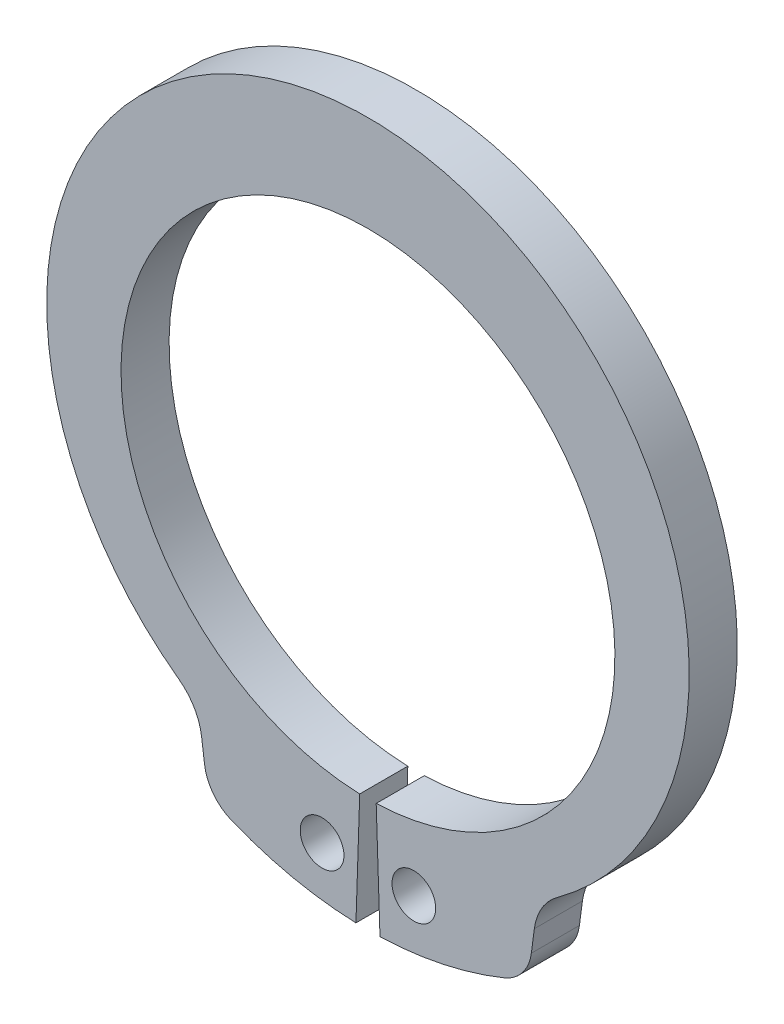
ISO-10303-21;
HEADER;
FILE_DESCRIPTION(('STEP AP214'),'2;1');
FILE_NAME('part.step','',(''),(''),'','','');
FILE_SCHEMA(('AUTOMOTIVE_DESIGN { 1 0 10303 214 1 1 1 1 }'));
ENDSEC;
DATA;
#1=APPLICATION_CONTEXT('core data for automotive mechanical design processes');
#2=APPLICATION_PROTOCOL_DEFINITION('international standard','automotive_design',2000,#1);
#3=PRODUCT_CONTEXT('',#1,'mechanical');
#4=PRODUCT('Part','Part','',(#3));
#5=PRODUCT_RELATED_PRODUCT_CATEGORY('part','',(#4));
#6=PRODUCT_DEFINITION_FORMATION('','',#4);
#7=PRODUCT_DEFINITION_CONTEXT('part definition',#1,'design');
#8=PRODUCT_DEFINITION('design','',#6,#7);
#9=PRODUCT_DEFINITION_SHAPE('','',#8);
#10=(LENGTH_UNIT() NAMED_UNIT(*) SI_UNIT(.MILLI.,.METRE.));
#11=(NAMED_UNIT(*) PLANE_ANGLE_UNIT() SI_UNIT($,.RADIAN.));
#12=(NAMED_UNIT(*) SI_UNIT($,.STERADIAN.) SOLID_ANGLE_UNIT());
#13=UNCERTAINTY_MEASURE_WITH_UNIT(LENGTH_MEASURE(1.E-05),#10,'distance_accuracy_value','');
#14=(GEOMETRIC_REPRESENTATION_CONTEXT(3) GLOBAL_UNCERTAINTY_ASSIGNED_CONTEXT((#13)) GLOBAL_UNIT_ASSIGNED_CONTEXT((#10,
#11,#12)) REPRESENTATION_CONTEXT('',''));
#15=CARTESIAN_POINT('',(0.,0.,0.));
#16=DIRECTION('',(0.,0.,1.));
#17=DIRECTION('',(1.,0.,0.));
#18=AXIS2_PLACEMENT_3D('',#15,#16,#17);
#19=CARTESIAN_POINT('',(0.,0.,-1.1));
#20=DIRECTION('',(0.,0.,1.));
#21=DIRECTION('',(1.,0.,0.));
#22=AXIS2_PLACEMENT_3D('',#19,#20,#21);
#23=CYLINDRICAL_SURFACE('',#22,5.65);
#24=CARTESIAN_POINT('',(0.,0.,0.));
#25=DIRECTION('',(0.,0.,-1.));
#26=DIRECTION('',(1.,0.,0.));
#27=AXIS2_PLACEMENT_3D('',#24,#25,#26);
#28=CIRCLE('',#27,5.65);
#29=CARTESIAN_POINT('',(-0.188333333333332,-5.64686023871279,0.));
#30=VERTEX_POINT('',#29);
#31=CARTESIAN_POINT('',(0.188333333333332,-5.6468602387128,0.));
#32=VERTEX_POINT('',#31);
#33=EDGE_CURVE('E166',#30,#32,#28,.T.);
#34=ORIENTED_EDGE('',*,*,#33,.F.);
#35=DIRECTION('',(0.,0.,1.));
#36=VECTOR('',#35,1.);
#37=CARTESIAN_POINT('',(-0.188333333333332,-5.64686023871279,-1.1));
#38=LINE('',#37,#36);
#39=CARTESIAN_POINT('',(-0.188333333333332,-5.64686023871279,-1.1));
#40=VERTEX_POINT('',#39);
#41=EDGE_CURVE('E11',#40,#30,#38,.T.);
#42=ORIENTED_EDGE('',*,*,#41,.F.);
#43=CARTESIAN_POINT('',(0.,0.,-1.1));
#44=DIRECTION('',(0.,0.,-1.));
#45=DIRECTION('',(1.,0.,0.));
#46=AXIS2_PLACEMENT_3D('',#43,#44,#45);
#47=CIRCLE('',#46,5.65);
#48=CARTESIAN_POINT('',(0.188333333333332,-5.6468602387128,-1.1));
#49=VERTEX_POINT('',#48);
#50=EDGE_CURVE('E211',#40,#49,#47,.T.);
#51=ORIENTED_EDGE('',*,*,#50,.T.);
#52=DIRECTION('',(0.,0.,1.));
#53=VECTOR('',#52,1.);
#54=CARTESIAN_POINT('',(0.188333333333332,-5.6468602387128,-1.1));
#55=LINE('',#54,#53);
#56=EDGE_CURVE('E41',#49,#32,#55,.T.);
#57=ORIENTED_EDGE('',*,*,#56,.T.);
#58=EDGE_LOOP('',(#34,#42,#51,#57));
#59=FACE_BOUND('',#58,.T.);
#60=ADVANCED_FACE('F38',(#59),#23,.F.);
#61=CARTESIAN_POINT('',(-0.188333333333332,-5.64686023871279,-1.1));
#62=DIRECTION('',(0.999444290037663,-0.0333333333333333,0.));
#63=DIRECTION('',(0.0333333333333333,0.999444290037663,0.));
#64=AXIS2_PLACEMENT_3D('',#61,#62,#63);
#65=PLANE('',#64);
#66=DIRECTION('',(0.0333333333333333,0.999444290037663,0.));
#67=VECTOR('',#66,1.);
#68=CARTESIAN_POINT('',(-0.188333333333332,-5.64686023871279,0.));
#69=LINE('',#68,#67);
#70=CARTESIAN_POINT('',(-0.275000000000001,-8.24541539281072,0.));
#71=VERTEX_POINT('',#70);
#72=EDGE_CURVE('E208',#71,#30,#69,.T.);
#73=ORIENTED_EDGE('',*,*,#72,.F.);
#74=DIRECTION('',(0.,0.,1.));
#75=VECTOR('',#74,1.);
#76=CARTESIAN_POINT('',(-0.275000000000001,-8.24541539281072,-1.1));
#77=LINE('',#76,#75);
#78=CARTESIAN_POINT('',(-0.275000000000001,-8.24541539281072,-1.1));
#79=VERTEX_POINT('',#78);
#80=EDGE_CURVE('E48',#79,#71,#77,.T.);
#81=ORIENTED_EDGE('',*,*,#80,.F.);
#82=DIRECTION('',(0.0333333333333333,0.999444290037663,0.));
#83=VECTOR('',#82,1.);
#84=CARTESIAN_POINT('',(-0.188333333333332,-5.64686023871279,-1.1));
#85=LINE('',#84,#83);
#86=EDGE_CURVE('E151',#79,#40,#85,.T.);
#87=ORIENTED_EDGE('',*,*,#86,.T.);
#88=ORIENTED_EDGE('',*,*,#41,.T.);
#89=EDGE_LOOP('',(#73,#81,#87,#88));
#90=FACE_BOUND('',#89,.T.);
#91=ADVANCED_FACE('F243',(#90),#65,.T.);
#92=CARTESIAN_POINT('',(0.,0.,-1.1));
#93=DIRECTION('',(0.,0.,1.));
#94=DIRECTION('',(1.,0.,0.));
#95=AXIS2_PLACEMENT_3D('',#92,#93,#94);
#96=CYLINDRICAL_SURFACE('',#95,8.25);
#97=CARTESIAN_POINT('',(0.,0.,0.));
#98=DIRECTION('',(0.,0.,1.));
#99=DIRECTION('',(1.,0.,0.));
#100=AXIS2_PLACEMENT_3D('',#97,#98,#99);
#101=CIRCLE('',#100,8.25);
#102=CARTESIAN_POINT('',(-3.12546960972697,-7.63504680527062,0.));
#103=VERTEX_POINT('',#102);
#104=EDGE_CURVE('E137',#103,#71,#101,.T.);
#105=ORIENTED_EDGE('',*,*,#104,.F.);
#106=DIRECTION('',(0.,0.,1.));
#107=VECTOR('',#106,1.);
#108=CARTESIAN_POINT('',(-3.12546960972697,-7.63504680527062,-1.1));
#109=LINE('',#108,#107);
#110=CARTESIAN_POINT('',(-3.12546960972697,-7.63504680527062,-1.1));
#111=VERTEX_POINT('',#110);
#112=EDGE_CURVE('E132',#111,#103,#109,.T.);
#113=ORIENTED_EDGE('',*,*,#112,.F.);
#114=CARTESIAN_POINT('',(0.,0.,-1.1));
#115=DIRECTION('',(0.,0.,1.));
#116=DIRECTION('',(1.,0.,0.));
#117=AXIS2_PLACEMENT_3D('',#114,#115,#116);
#118=CIRCLE('',#117,8.25);
#119=EDGE_CURVE('E135',#111,#79,#118,.T.);
#120=ORIENTED_EDGE('',*,*,#119,.T.);
#121=ORIENTED_EDGE('',*,*,#80,.T.);
#122=EDGE_LOOP('',(#105,#113,#120,#121));
#123=FACE_BOUND('',#122,.T.);
#124=ADVANCED_FACE('F134',(#123),#96,.T.);
#125=CARTESIAN_POINT('',(-2.74662480854794,-6.70958658644994,-1.1));
#126=DIRECTION('',(0.,0.,1.));
#127=DIRECTION('',(1.,0.,0.));
#128=AXIS2_PLACEMENT_3D('',#125,#126,#127);
#129=CYLINDRICAL_SURFACE('',#128,1.);
#130=CARTESIAN_POINT('',(-2.74662480854794,-6.70958658644994,0.));
#131=DIRECTION('',(0.,0.,1.));
#132=DIRECTION('',(1.,0.,0.));
#133=AXIS2_PLACEMENT_3D('',#130,#131,#132);
#134=CIRCLE('',#133,1.);
#135=CARTESIAN_POINT('',(-3.73806966992175,-6.84011277867,0.));
#136=VERTEX_POINT('',#135);
#137=EDGE_CURVE('E203',#136,#103,#134,.T.);
#138=ORIENTED_EDGE('',*,*,#137,.F.);
#139=DIRECTION('',(0.,0.,1.));
#140=VECTOR('',#139,1.);
#141=CARTESIAN_POINT('',(-3.73806966992175,-6.84011277867,-1.1));
#142=LINE('',#141,#140);
#143=CARTESIAN_POINT('',(-3.73806966992175,-6.84011277867,-1.1));
#144=VERTEX_POINT('',#143);
#145=EDGE_CURVE('E143',#144,#136,#142,.T.);
#146=ORIENTED_EDGE('',*,*,#145,.F.);
#147=CARTESIAN_POINT('',(-2.74662480854794,-6.70958658644994,-1.1));
#148=DIRECTION('',(0.,0.,1.));
#149=DIRECTION('',(1.,0.,0.));
#150=AXIS2_PLACEMENT_3D('',#147,#148,#149);
#151=CIRCLE('',#150,1.);
#152=EDGE_CURVE('E149',#144,#111,#151,.T.);
#153=ORIENTED_EDGE('',*,*,#152,.T.);
#154=ORIENTED_EDGE('',*,*,#112,.T.);
#155=EDGE_LOOP('',(#138,#146,#153,#154));
#156=FACE_BOUND('',#155,.T.);
#157=ADVANCED_FACE('F154',(#156),#129,.T.);
#158=CARTESIAN_POINT('',(-3.80660395669724,-6.31954318803232,-1.1));
#159=DIRECTION('',(-0.991444861373811,-0.130526192220045,0.));
#160=DIRECTION('',(0.130526192220045,-0.991444861373811,0.));
#161=AXIS2_PLACEMENT_3D('',#158,#159,#160);
#162=PLANE('',#161);
#163=DIRECTION('',(0.130526192220045,-0.991444861373811,0.));
#164=VECTOR('',#163,1.);
#165=CARTESIAN_POINT('',(-3.80660395669724,-6.31954318803232,0.));
#166=LINE('',#165,#164);
#167=CARTESIAN_POINT('',(-3.80660395669724,-6.31954318803232,0.));
#168=VERTEX_POINT('',#167);
#169=EDGE_CURVE('E199',#168,#136,#166,.T.);
#170=ORIENTED_EDGE('',*,*,#169,.F.);
#171=DIRECTION('',(0.,0.,1.));
#172=VECTOR('',#171,1.);
#173=CARTESIAN_POINT('',(-3.80660395669724,-6.31954318803232,-1.1));
#174=LINE('',#173,#172);
#175=CARTESIAN_POINT('',(-3.80660395669724,-6.31954318803232,-1.1));
#176=VERTEX_POINT('',#175);
#177=EDGE_CURVE('E217',#176,#168,#174,.T.);
#178=ORIENTED_EDGE('',*,*,#177,.F.);
#179=DIRECTION('',(0.130526192220045,-0.991444861373811,0.));
#180=VECTOR('',#179,1.);
#181=CARTESIAN_POINT('',(-3.80660395669724,-6.31954318803232,-1.1));
#182=LINE('',#181,#180);
#183=EDGE_CURVE('E156',#176,#144,#182,.T.);
#184=ORIENTED_EDGE('',*,*,#183,.T.);
#185=ORIENTED_EDGE('',*,*,#145,.T.);
#186=EDGE_LOOP('',(#170,#178,#184,#185));
#187=FACE_BOUND('',#186,.T.);
#188=ADVANCED_FACE('F256',(#187),#162,.T.);
#189=CARTESIAN_POINT('',(-5.09451495681991,-6.48909988786875,-1.1));
#190=DIRECTION('',(0.,0.,1.));
#191=DIRECTION('',(1.,0.,0.));
#192=AXIS2_PLACEMENT_3D('',#189,#190,#191);
#193=CYLINDRICAL_SURFACE('',#192,1.29902433337347);
#194=CARTESIAN_POINT('',(-5.09451495681991,-6.48909988786875,0.));
#195=DIRECTION('',(0.,0.,-1.));
#196=DIRECTION('',(1.,0.,0.));
#197=AXIS2_PLACEMENT_3D('',#194,#195,#196);
#198=CIRCLE('',#197,1.29902433337347);
#199=CARTESIAN_POINT('',(-4.32934225762726,-5.43934993711542,0.));
#200=VERTEX_POINT('',#199);
#201=EDGE_CURVE('E195',#200,#168,#198,.T.);
#202=ORIENTED_EDGE('',*,*,#201,.F.);
#203=DIRECTION('',(0.,0.,1.));
#204=VECTOR('',#203,1.);
#205=CARTESIAN_POINT('',(-4.32934225762726,-5.43934993711542,-1.1));
#206=LINE('',#205,#204);
#207=CARTESIAN_POINT('',(-4.32934225762726,-5.43934993711542,-1.1));
#208=VERTEX_POINT('',#207);
#209=EDGE_CURVE('E220',#208,#200,#206,.T.);
#210=ORIENTED_EDGE('',*,*,#209,.F.);
#211=CARTESIAN_POINT('',(-5.09451495681991,-6.48909988786875,-1.1));
#212=DIRECTION('',(0.,0.,-1.));
#213=DIRECTION('',(1.,0.,0.));
#214=AXIS2_PLACEMENT_3D('',#211,#212,#213);
#215=CIRCLE('',#214,1.29902433337347);
#216=EDGE_CURVE('E160',#208,#176,#215,.T.);
#217=ORIENTED_EDGE('',*,*,#216,.T.);
#218=ORIENTED_EDGE('',*,*,#177,.T.);
#219=EDGE_LOOP('',(#202,#210,#217,#218));
#220=FACE_BOUND('',#219,.T.);
#221=ADVANCED_FACE('F259',(#220),#193,.F.);
#222=CARTESIAN_POINT('',(0.,0.500128596990302,-1.1));
#223=DIRECTION('',(0.,0.,1.));
#224=DIRECTION('',(1.,0.,0.));
#225=AXIS2_PLACEMENT_3D('',#222,#223,#224);
#226=CYLINDRICAL_SURFACE('',#225,7.3498714030097);
#227=CARTESIAN_POINT('',(0.,0.500128596990302,0.));
#228=DIRECTION('',(0.,0.,1.));
#229=DIRECTION('',(1.,0.,0.));
#230=AXIS2_PLACEMENT_3D('',#227,#228,#229);
#231=CIRCLE('',#230,7.3498714030097);
#232=CARTESIAN_POINT('',(4.32934225762725,-5.43934993711543,0.));
#233=VERTEX_POINT('',#232);
#234=EDGE_CURVE('E191',#233,#200,#231,.T.);
#235=ORIENTED_EDGE('',*,*,#234,.F.);
#236=DIRECTION('',(0.,0.,1.));
#237=VECTOR('',#236,1.);
#238=CARTESIAN_POINT('',(4.32934225762725,-5.43934993711543,-1.1));
#239=LINE('',#238,#237);
#240=CARTESIAN_POINT('',(4.32934225762725,-5.43934993711543,-1.1));
#241=VERTEX_POINT('',#240);
#242=EDGE_CURVE('E223',#241,#233,#239,.T.);
#243=ORIENTED_EDGE('',*,*,#242,.F.);
#244=CARTESIAN_POINT('',(0.,0.500128596990302,-1.1));
#245=DIRECTION('',(0.,0.,1.));
#246=DIRECTION('',(1.,0.,0.));
#247=AXIS2_PLACEMENT_3D('',#244,#245,#246);
#248=CIRCLE('',#247,7.3498714030097);
#249=EDGE_CURVE('E344',#241,#208,#248,.T.);
#250=ORIENTED_EDGE('',*,*,#249,.T.);
#251=ORIENTED_EDGE('',*,*,#209,.T.);
#252=EDGE_LOOP('',(#235,#243,#250,#251));
#253=FACE_BOUND('',#252,.T.);
#254=ADVANCED_FACE('F263',(#253),#226,.T.);
#255=CARTESIAN_POINT('',(5.09451495681991,-6.48909988786875,-1.1));
#256=DIRECTION('',(0.,0.,1.));
#257=DIRECTION('',(1.,0.,0.));
#258=AXIS2_PLACEMENT_3D('',#255,#256,#257);
#259=CYLINDRICAL_SURFACE('',#258,1.29902433337347);
#260=CARTESIAN_POINT('',(5.09451495681991,-6.48909988786875,0.));
#261=DIRECTION('',(0.,0.,-1.));
#262=DIRECTION('',(1.,0.,0.));
#263=AXIS2_PLACEMENT_3D('',#260,#261,#262);
#264=CIRCLE('',#263,1.29902433337347);
#265=CARTESIAN_POINT('',(3.80660395669724,-6.31954318803232,0.));
#266=VERTEX_POINT('',#265);
#267=EDGE_CURVE('E187',#266,#233,#264,.T.);
#268=ORIENTED_EDGE('',*,*,#267,.F.);
#269=DIRECTION('',(0.,0.,1.));
#270=VECTOR('',#269,1.);
#271=CARTESIAN_POINT('',(3.80660395669724,-6.31954318803232,-1.1));
#272=LINE('',#271,#270);
#273=CARTESIAN_POINT('',(3.80660395669724,-6.31954318803232,-1.1));
#274=VERTEX_POINT('',#273);
#275=EDGE_CURVE('E226',#274,#266,#272,.T.);
#276=ORIENTED_EDGE('',*,*,#275,.F.);
#277=CARTESIAN_POINT('',(5.09451495681991,-6.48909988786875,-1.1));
#278=DIRECTION('',(0.,0.,-1.));
#279=DIRECTION('',(1.,0.,0.));
#280=AXIS2_PLACEMENT_3D('',#277,#278,#279);
#281=CIRCLE('',#280,1.29902433337347);
#282=EDGE_CURVE('E340',#274,#241,#281,.T.);
#283=ORIENTED_EDGE('',*,*,#282,.T.);
#284=ORIENTED_EDGE('',*,*,#242,.T.);
#285=EDGE_LOOP('',(#268,#276,#283,#284));
#286=FACE_BOUND('',#285,.T.);
#287=ADVANCED_FACE('F267',(#286),#259,.F.);
#288=CARTESIAN_POINT('',(3.80660395669724,-6.31954318803232,-1.1));
#289=DIRECTION('',(0.991444861373811,-0.130526192220045,0.));
#290=DIRECTION('',(0.130526192220045,0.991444861373811,0.));
#291=AXIS2_PLACEMENT_3D('',#288,#289,#290);
#292=PLANE('',#291);
#293=DIRECTION('',(0.130526192220045,0.991444861373811,0.));
#294=VECTOR('',#293,1.);
#295=CARTESIAN_POINT('',(3.80660395669724,-6.31954318803232,0.));
#296=LINE('',#295,#294);
#297=CARTESIAN_POINT('',(3.73806966992175,-6.84011277867,0.));
#298=VERTEX_POINT('',#297);
#299=EDGE_CURVE('E183',#298,#266,#296,.T.);
#300=ORIENTED_EDGE('',*,*,#299,.F.);
#301=DIRECTION('',(0.,0.,1.));
#302=VECTOR('',#301,1.);
#303=CARTESIAN_POINT('',(3.73806966992175,-6.84011277867,-1.1));
#304=LINE('',#303,#302);
#305=CARTESIAN_POINT('',(3.73806966992175,-6.84011277867,-1.1));
#306=VERTEX_POINT('',#305);
#307=EDGE_CURVE('E229',#306,#298,#304,.T.);
#308=ORIENTED_EDGE('',*,*,#307,.F.);
#309=DIRECTION('',(0.130526192220045,0.991444861373811,0.));
#310=VECTOR('',#309,1.);
#311=CARTESIAN_POINT('',(3.80660395669724,-6.31954318803232,-1.1));
#312=LINE('',#311,#310);
#313=EDGE_CURVE('E336',#306,#274,#312,.T.);
#314=ORIENTED_EDGE('',*,*,#313,.T.);
#315=ORIENTED_EDGE('',*,*,#275,.T.);
#316=EDGE_LOOP('',(#300,#308,#314,#315));
#317=FACE_BOUND('',#316,.T.);
#318=ADVANCED_FACE('F271',(#317),#292,.T.);
#319=CARTESIAN_POINT('',(2.74662480854793,-6.70958658644994,-1.1));
#320=DIRECTION('',(0.,0.,1.));
#321=DIRECTION('',(1.,0.,0.));
#322=AXIS2_PLACEMENT_3D('',#319,#320,#321);
#323=CYLINDRICAL_SURFACE('',#322,1.);
#324=CARTESIAN_POINT('',(2.74662480854793,-6.70958658644994,0.));
#325=DIRECTION('',(0.,0.,1.));
#326=DIRECTION('',(-1.,0.,0.));
#327=AXIS2_PLACEMENT_3D('',#324,#325,#326);
#328=CIRCLE('',#327,1.);
#329=CARTESIAN_POINT('',(3.12546960972696,-7.63504680527063,0.));
#330=VERTEX_POINT('',#329);
#331=EDGE_CURVE('E179',#330,#298,#328,.T.);
#332=ORIENTED_EDGE('',*,*,#331,.F.);
#333=DIRECTION('',(0.,0.,1.));
#334=VECTOR('',#333,1.);
#335=CARTESIAN_POINT('',(3.12546960972696,-7.63504680527063,-1.1));
#336=LINE('',#335,#334);
#337=CARTESIAN_POINT('',(3.12546960972696,-7.63504680527063,-1.1));
#338=VERTEX_POINT('',#337);
#339=EDGE_CURVE('E232',#338,#330,#336,.T.);
#340=ORIENTED_EDGE('',*,*,#339,.F.);
#341=CARTESIAN_POINT('',(2.74662480854793,-6.70958658644994,-1.1));
#342=DIRECTION('',(0.,0.,1.));
#343=DIRECTION('',(-1.,0.,0.));
#344=AXIS2_PLACEMENT_3D('',#341,#342,#343);
#345=CIRCLE('',#344,1.);
#346=EDGE_CURVE('E332',#338,#306,#345,.T.);
#347=ORIENTED_EDGE('',*,*,#346,.T.);
#348=ORIENTED_EDGE('',*,*,#307,.T.);
#349=EDGE_LOOP('',(#332,#340,#347,#348));
#350=FACE_BOUND('',#349,.T.);
#351=ADVANCED_FACE('F275',(#350),#323,.T.);
#352=CARTESIAN_POINT('',(0.,0.,-1.1));
#353=DIRECTION('',(0.,0.,1.));
#354=DIRECTION('',(1.,0.,0.));
#355=AXIS2_PLACEMENT_3D('',#352,#353,#354);
#356=CYLINDRICAL_SURFACE('',#355,8.25);
#357=CARTESIAN_POINT('',(0.,0.,0.));
#358=DIRECTION('',(0.,0.,1.));
#359=DIRECTION('',(1.,0.,0.));
#360=AXIS2_PLACEMENT_3D('',#357,#358,#359);
#361=CIRCLE('',#360,8.25);
#362=CARTESIAN_POINT('',(0.274999999999999,-8.24541539281072,0.));
#363=VERTEX_POINT('',#362);
#364=EDGE_CURVE('E175',#363,#330,#361,.T.);
#365=ORIENTED_EDGE('',*,*,#364,.F.);
#366=DIRECTION('',(0.,0.,1.));
#367=VECTOR('',#366,1.);
#368=CARTESIAN_POINT('',(0.274999999999999,-8.24541539281072,-1.1));
#369=LINE('',#368,#367);
#370=CARTESIAN_POINT('',(0.274999999999999,-8.24541539281072,-1.1));
#371=VERTEX_POINT('',#370);
#372=EDGE_CURVE('E234',#371,#363,#369,.T.);
#373=ORIENTED_EDGE('',*,*,#372,.F.);
#374=CARTESIAN_POINT('',(0.,0.,-1.1));
#375=DIRECTION('',(0.,0.,1.));
#376=DIRECTION('',(1.,0.,0.));
#377=AXIS2_PLACEMENT_3D('',#374,#375,#376);
#378=CIRCLE('',#377,8.25);
#379=EDGE_CURVE('E328',#371,#338,#378,.T.);
#380=ORIENTED_EDGE('',*,*,#379,.T.);
#381=ORIENTED_EDGE('',*,*,#339,.T.);
#382=EDGE_LOOP('',(#365,#373,#380,#381));
#383=FACE_BOUND('',#382,.T.);
#384=ADVANCED_FACE('F279',(#383),#356,.T.);
#385=CARTESIAN_POINT('',(0.188333333333332,-5.6468602387128,-1.1));
#386=DIRECTION('',(-0.999444290037663,-0.0333333333333333,0.));
#387=DIRECTION('',(0.0333333333333333,-0.999444290037663,0.));
#388=AXIS2_PLACEMENT_3D('',#385,#386,#387);
#389=PLANE('',#388);
#390=DIRECTION('',(0.0333333333333333,-0.999444290037663,0.));
#391=VECTOR('',#390,1.);
#392=CARTESIAN_POINT('',(0.188333333333332,-5.6468602387128,0.));
#393=LINE('',#392,#391);
#394=EDGE_CURVE('E170',#32,#363,#393,.T.);
#395=ORIENTED_EDGE('',*,*,#394,.F.);
#396=ORIENTED_EDGE('',*,*,#56,.F.);
#397=DIRECTION('',(0.0333333333333333,-0.999444290037663,0.));
#398=VECTOR('',#397,1.);
#399=CARTESIAN_POINT('',(0.188333333333332,-5.6468602387128,-1.1));
#400=LINE('',#399,#398);
#401=EDGE_CURVE('E325',#49,#371,#400,.T.);
#402=ORIENTED_EDGE('',*,*,#401,.T.);
#403=ORIENTED_EDGE('',*,*,#372,.T.);
#404=EDGE_LOOP('',(#395,#396,#402,#403));
#405=FACE_BOUND('',#404,.T.);
#406=ADVANCED_FACE('F240',(#405),#389,.T.);
#407=CARTESIAN_POINT('',(0.,0.,-1.1));
#408=DIRECTION('',(0.,0.,1.));
#409=DIRECTION('',(1.,0.,0.));
#410=AXIS2_PLACEMENT_3D('',#407,#408,#409);
#411=PLANE('',#410);
#412=CARTESIAN_POINT('',(-1.05,-7.04720689351462,-1.1));
#413=DIRECTION('',(0.,0.,1.));
#414=DIRECTION('',(1.,0.,0.));
#415=AXIS2_PLACEMENT_3D('',#412,#413,#414);
#416=CIRCLE('',#415,0.5);
#417=CARTESIAN_POINT('',(-0.550000000000002,-7.04720689351462,-1.1));
#418=VERTEX_POINT('',#417);
#419=EDGE_CURVE('E306',#418,#418,#416,.T.);
#420=ORIENTED_EDGE('',*,*,#419,.T.);
#421=EDGE_LOOP('',(#420));
#422=FACE_BOUND('',#421,.T.);
#423=CARTESIAN_POINT('',(1.05,-7.04720689351462,-1.1));
#424=DIRECTION('',(0.,0.,1.));
#425=DIRECTION('',(1.,0.,0.));
#426=AXIS2_PLACEMENT_3D('',#423,#424,#425);
#427=CIRCLE('',#426,0.5);
#428=CARTESIAN_POINT('',(1.55,-7.04720689351462,-1.1));
#429=VERTEX_POINT('',#428);
#430=EDGE_CURVE('E171',#429,#429,#427,.T.);
#431=ORIENTED_EDGE('',*,*,#430,.T.);
#432=EDGE_LOOP('',(#431));
#433=FACE_BOUND('',#432,.T.);
#434=ORIENTED_EDGE('',*,*,#50,.F.);
#435=ORIENTED_EDGE('',*,*,#86,.F.);
#436=ORIENTED_EDGE('',*,*,#119,.F.);
#437=ORIENTED_EDGE('',*,*,#152,.F.);
#438=ORIENTED_EDGE('',*,*,#183,.F.);
#439=ORIENTED_EDGE('',*,*,#216,.F.);
#440=ORIENTED_EDGE('',*,*,#249,.F.);
#441=ORIENTED_EDGE('',*,*,#282,.F.);
#442=ORIENTED_EDGE('',*,*,#313,.F.);
#443=ORIENTED_EDGE('',*,*,#346,.F.);
#444=ORIENTED_EDGE('',*,*,#379,.F.);
#445=ORIENTED_EDGE('',*,*,#401,.F.);
#446=EDGE_LOOP('',(#434,#435,#436,#437,#438,#439,#440,#441,#442,#443,#444,#445));
#447=FACE_BOUND('',#446,.T.);
#448=ADVANCED_FACE('F147',(#422,#433,#447),#411,.F.);
#449=CARTESIAN_POINT('',(0.,0.,0.));
#450=DIRECTION('',(0.,0.,1.));
#451=DIRECTION('',(1.,0.,0.));
#452=AXIS2_PLACEMENT_3D('',#449,#450,#451);
#453=PLANE('',#452);
#454=CARTESIAN_POINT('',(-1.05,-7.04720689351462,0.));
#455=DIRECTION('',(0.,0.,1.));
#456=DIRECTION('',(1.,0.,0.));
#457=AXIS2_PLACEMENT_3D('',#454,#455,#456);
#458=CIRCLE('',#457,0.5);
#459=CARTESIAN_POINT('',(-0.550000000000002,-7.04720689351462,0.));
#460=VERTEX_POINT('',#459);
#461=EDGE_CURVE('E309',#460,#460,#458,.T.);
#462=ORIENTED_EDGE('',*,*,#461,.F.);
#463=EDGE_LOOP('',(#462));
#464=FACE_BOUND('',#463,.T.);
#465=CARTESIAN_POINT('',(1.05,-7.04720689351462,0.));
#466=DIRECTION('',(0.,0.,1.));
#467=DIRECTION('',(1.,0.,0.));
#468=AXIS2_PLACEMENT_3D('',#465,#466,#467);
#469=CIRCLE('',#468,0.5);
#470=CARTESIAN_POINT('',(1.55,-7.04720689351462,0.));
#471=VERTEX_POINT('',#470);
#472=EDGE_CURVE('E314',#471,#471,#469,.T.);
#473=ORIENTED_EDGE('',*,*,#472,.F.);
#474=EDGE_LOOP('',(#473));
#475=FACE_BOUND('',#474,.T.);
#476=ORIENTED_EDGE('',*,*,#33,.T.);
#477=ORIENTED_EDGE('',*,*,#394,.T.);
#478=ORIENTED_EDGE('',*,*,#364,.T.);
#479=ORIENTED_EDGE('',*,*,#331,.T.);
#480=ORIENTED_EDGE('',*,*,#299,.T.);
#481=ORIENTED_EDGE('',*,*,#267,.T.);
#482=ORIENTED_EDGE('',*,*,#234,.T.);
#483=ORIENTED_EDGE('',*,*,#201,.T.);
#484=ORIENTED_EDGE('',*,*,#169,.T.);
#485=ORIENTED_EDGE('',*,*,#137,.T.);
#486=ORIENTED_EDGE('',*,*,#104,.T.);
#487=ORIENTED_EDGE('',*,*,#72,.T.);
#488=EDGE_LOOP('',(#476,#477,#478,#479,#480,#481,#482,#483,#484,#485,#486,#487));
#489=FACE_BOUND('',#488,.T.);
#490=ADVANCED_FACE('F242',(#464,#475,#489),#453,.T.);
#491=CARTESIAN_POINT('',(1.05,-7.04720689351462,-1.1));
#492=DIRECTION('',(0.,0.,1.));
#493=DIRECTION('',(1.,0.,0.));
#494=AXIS2_PLACEMENT_3D('',#491,#492,#493);
#495=CYLINDRICAL_SURFACE('',#494,0.5);
#496=ORIENTED_EDGE('',*,*,#430,.F.);
#497=EDGE_LOOP('',(#496));
#498=FACE_BOUND('',#497,.T.);
#499=ORIENTED_EDGE('',*,*,#472,.T.);
#500=EDGE_LOOP('',(#499));
#501=FACE_BOUND('',#500,.T.);
#502=ADVANCED_FACE('F291',(#498,#501),#495,.F.);
#503=CARTESIAN_POINT('',(-1.05,-7.04720689351462,-1.1));
#504=DIRECTION('',(0.,0.,1.));
#505=DIRECTION('',(1.,0.,0.));
#506=AXIS2_PLACEMENT_3D('',#503,#504,#505);
#507=CYLINDRICAL_SURFACE('',#506,0.5);
#508=ORIENTED_EDGE('',*,*,#419,.F.);
#509=EDGE_LOOP('',(#508));
#510=FACE_BOUND('',#509,.T.);
#511=ORIENTED_EDGE('',*,*,#461,.T.);
#512=EDGE_LOOP('',(#511));
#513=FACE_BOUND('',#512,.T.);
#514=ADVANCED_FACE('F298',(#510,#513),#507,.F.);
#515=CLOSED_SHELL('',(#60,#91,#124,#157,#188,#221,#254,#287,#318,#351,#384,#406,#448,#490,#502,#514));
#516=MANIFOLD_SOLID_BREP('B2',#515);
#517=ADVANCED_BREP_SHAPE_REPRESENTATION('',(#18,#516),#14);
#518=SHAPE_DEFINITION_REPRESENTATION(#9,#517);
ENDSEC;
END-ISO-10303-21;
